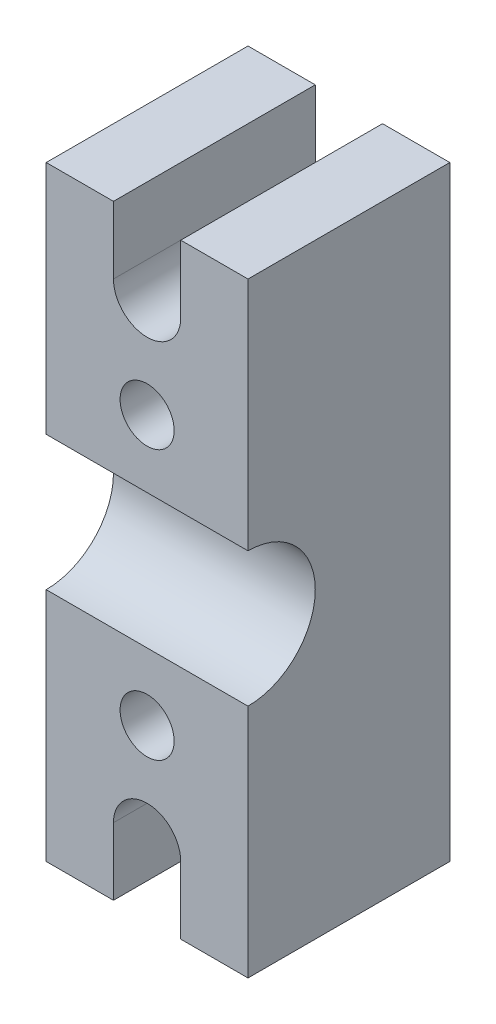
ISO-10303-21;
HEADER;
FILE_DESCRIPTION(('STEP AP214'),'2;1');
FILE_NAME('part.step','',(''),(''),'','','');
FILE_SCHEMA(('AUTOMOTIVE_DESIGN { 1 0 10303 214 1 1 1 1 }'));
ENDSEC;
DATA;
#1=APPLICATION_CONTEXT('core data for automotive mechanical design processes');
#2=APPLICATION_PROTOCOL_DEFINITION('international standard','automotive_design',2000,#1);
#3=PRODUCT_CONTEXT('',#1,'mechanical');
#4=PRODUCT('Part','Part','',(#3));
#5=PRODUCT_RELATED_PRODUCT_CATEGORY('part','',(#4));
#6=PRODUCT_DEFINITION_FORMATION('','',#4);
#7=PRODUCT_DEFINITION_CONTEXT('part definition',#1,'design');
#8=PRODUCT_DEFINITION('design','',#6,#7);
#9=PRODUCT_DEFINITION_SHAPE('','',#8);
#10=(LENGTH_UNIT() NAMED_UNIT(*) SI_UNIT(.MILLI.,.METRE.));
#11=(NAMED_UNIT(*) PLANE_ANGLE_UNIT() SI_UNIT($,.RADIAN.));
#12=(NAMED_UNIT(*) SI_UNIT($,.STERADIAN.) SOLID_ANGLE_UNIT());
#13=UNCERTAINTY_MEASURE_WITH_UNIT(LENGTH_MEASURE(1.E-05),#10,'distance_accuracy_value','');
#14=(GEOMETRIC_REPRESENTATION_CONTEXT(3) GLOBAL_UNCERTAINTY_ASSIGNED_CONTEXT((#13)) GLOBAL_UNIT_ASSIGNED_CONTEXT((#10,
#11,#12)) REPRESENTATION_CONTEXT('',''));
#15=CARTESIAN_POINT('',(0.,0.,0.));
#16=DIRECTION('',(0.,0.,1.));
#17=DIRECTION('',(1.,0.,0.));
#18=AXIS2_PLACEMENT_3D('',#15,#16,#17);
#19=CARTESIAN_POINT('',(0.,-22.225,19.05));
#20=DIRECTION('',(0.,0.,-1.));
#21=DIRECTION('',(-1.,0.,0.));
#22=AXIS2_PLACEMENT_3D('',#19,#20,#21);
#23=PLANE('',#22);
#24=CARTESIAN_POINT('',(0.,12.7,19.05));
#25=DIRECTION('',(0.,0.,1.));
#26=DIRECTION('',(1.,0.,0.));
#27=AXIS2_PLACEMENT_3D('',#24,#25,#26);
#28=CIRCLE('',#27,2.55269999999999);
#29=CARTESIAN_POINT('',(2.55269999999999,12.7,19.05));
#30=VERTEX_POINT('',#29);
#31=EDGE_CURVE('E276',#30,#30,#28,.T.);
#32=ORIENTED_EDGE('',*,*,#31,.F.);
#33=EDGE_LOOP('',(#32));
#34=FACE_BOUND('',#33,.T.);
#35=DIRECTION('',(0.,-1.,0.));
#36=VECTOR('',#35,1.);
#37=CARTESIAN_POINT('',(-9.525,-28.575,19.05));
#38=LINE('',#37,#36);
#39=CARTESIAN_POINT('',(-9.525,28.575,19.05));
#40=VERTEX_POINT('',#39);
#41=CARTESIAN_POINT('',(-9.525,6.35,19.05));
#42=VERTEX_POINT('',#41);
#43=EDGE_CURVE('E118',#40,#42,#38,.T.);
#44=ORIENTED_EDGE('',*,*,#43,.T.);
#45=DIRECTION('',(1.,0.,0.));
#46=VECTOR('',#45,1.);
#47=CARTESIAN_POINT('',(-9.525,6.35,19.05));
#48=LINE('',#47,#46);
#49=CARTESIAN_POINT('',(9.525,6.35,19.05));
#50=VERTEX_POINT('',#49);
#51=EDGE_CURVE('E11',#42,#50,#48,.T.);
#52=ORIENTED_EDGE('',*,*,#51,.T.);
#53=DIRECTION('',(0.,1.,0.));
#54=VECTOR('',#53,1.);
#55=CARTESIAN_POINT('',(9.525,-28.575,19.05));
#56=LINE('',#55,#54);
#57=CARTESIAN_POINT('',(9.525,28.575,19.05));
#58=VERTEX_POINT('',#57);
#59=EDGE_CURVE('E251',#50,#58,#56,.T.);
#60=ORIENTED_EDGE('',*,*,#59,.T.);
#61=DIRECTION('',(-1.,0.,0.));
#62=VECTOR('',#61,1.);
#63=CARTESIAN_POINT('',(9.525,28.575,19.05));
#64=LINE('',#63,#62);
#65=CARTESIAN_POINT('',(3.175,28.575,19.05));
#66=VERTEX_POINT('',#65);
#67=EDGE_CURVE('E152',#58,#66,#64,.T.);
#68=ORIENTED_EDGE('',*,*,#67,.T.);
#69=DIRECTION('',(0.,-1.,0.));
#70=VECTOR('',#69,1.);
#71=CARTESIAN_POINT('',(3.175,22.225,19.05));
#72=LINE('',#71,#70);
#73=CARTESIAN_POINT('',(3.175,22.225,19.05));
#74=VERTEX_POINT('',#73);
#75=EDGE_CURVE('E146',#66,#74,#72,.T.);
#76=ORIENTED_EDGE('',*,*,#75,.T.);
#77=CARTESIAN_POINT('',(0.,22.225,19.05));
#78=DIRECTION('',(0.,0.,-1.));
#79=DIRECTION('',(1.,0.,0.));
#80=AXIS2_PLACEMENT_3D('',#77,#78,#79);
#81=CIRCLE('',#80,3.175);
#82=CARTESIAN_POINT('',(-3.175,22.225,19.05));
#83=VERTEX_POINT('',#82);
#84=EDGE_CURVE('E149',#74,#83,#81,.T.);
#85=ORIENTED_EDGE('',*,*,#84,.T.);
#86=DIRECTION('',(0.,1.,0.));
#87=VECTOR('',#86,1.);
#88=CARTESIAN_POINT('',(-3.175,28.575,19.05));
#89=LINE('',#88,#87);
#90=CARTESIAN_POINT('',(-3.175,28.575,19.05));
#91=VERTEX_POINT('',#90);
#92=EDGE_CURVE('E65',#83,#91,#89,.T.);
#93=ORIENTED_EDGE('',*,*,#92,.T.);
#94=DIRECTION('',(-1.,0.,0.));
#95=VECTOR('',#94,1.);
#96=CARTESIAN_POINT('',(-3.175,28.575,19.05));
#97=LINE('',#96,#95);
#98=EDGE_CURVE('E197',#91,#40,#97,.T.);
#99=ORIENTED_EDGE('',*,*,#98,.T.);
#100=EDGE_LOOP('',(#44,#52,#60,#68,#76,#85,#93,#99));
#101=FACE_BOUND('',#100,.T.);
#102=ADVANCED_FACE('F41',(#34,#101),#23,.F.);
#103=CARTESIAN_POINT('',(-3.175,28.575,19.05));
#104=DIRECTION('',(0.,-1.,0.));
#105=DIRECTION('',(1.,0.,0.));
#106=AXIS2_PLACEMENT_3D('',#103,#104,#105);
#107=PLANE('',#106);
#108=DIRECTION('',(-1.,0.,0.));
#109=VECTOR('',#108,1.);
#110=CARTESIAN_POINT('',(-3.175,28.575,0.));
#111=LINE('',#110,#109);
#112=CARTESIAN_POINT('',(-3.175,28.575,0.));
#113=VERTEX_POINT('',#112);
#114=CARTESIAN_POINT('',(-9.525,28.575,0.));
#115=VERTEX_POINT('',#114);
#116=EDGE_CURVE('E173',#113,#115,#111,.T.);
#117=ORIENTED_EDGE('',*,*,#116,.T.);
#118=DIRECTION('',(0.,0.,-1.));
#119=VECTOR('',#118,1.);
#120=CARTESIAN_POINT('',(-9.525,28.575,19.05));
#121=LINE('',#120,#119);
#122=EDGE_CURVE('E222',#40,#115,#121,.T.);
#123=ORIENTED_EDGE('',*,*,#122,.F.);
#124=ORIENTED_EDGE('',*,*,#98,.F.);
#125=DIRECTION('',(0.,0.,-1.));
#126=VECTOR('',#125,1.);
#127=CARTESIAN_POINT('',(-3.175,28.575,19.05));
#128=LINE('',#127,#126);
#129=EDGE_CURVE('E169',#91,#113,#128,.T.);
#130=ORIENTED_EDGE('',*,*,#129,.T.);
#131=EDGE_LOOP('',(#117,#123,#124,#130));
#132=FACE_BOUND('',#131,.T.);
#133=ADVANCED_FACE('F43',(#132),#107,.F.);
#134=CARTESIAN_POINT('',(-9.525,-28.575,19.05));
#135=DIRECTION('',(1.,0.,0.));
#136=DIRECTION('',(0.,0.,-1.));
#137=AXIS2_PLACEMENT_3D('',#134,#135,#136);
#138=PLANE('',#137);
#139=CARTESIAN_POINT('',(-9.525,-6.35,19.05));
#140=VERTEX_POINT('',#139);
#141=CARTESIAN_POINT('',(-9.525,-28.575,19.05));
#142=VERTEX_POINT('',#141);
#143=EDGE_CURVE('E227',#140,#142,#38,.T.);
#144=ORIENTED_EDGE('',*,*,#143,.F.);
#145=CARTESIAN_POINT('',(-9.525,0.,19.05));
#146=DIRECTION('',(1.,0.,0.));
#147=DIRECTION('',(0.,0.,-1.));
#148=AXIS2_PLACEMENT_3D('',#145,#146,#147);
#149=CIRCLE('',#148,6.35);
#150=EDGE_CURVE('E56',#140,#42,#149,.T.);
#151=ORIENTED_EDGE('',*,*,#150,.T.);
#152=ORIENTED_EDGE('',*,*,#43,.F.);
#153=ORIENTED_EDGE('',*,*,#122,.T.);
#154=DIRECTION('',(0.,-1.,0.));
#155=VECTOR('',#154,1.);
#156=CARTESIAN_POINT('',(-9.525,-28.575,0.));
#157=LINE('',#156,#155);
#158=CARTESIAN_POINT('',(-9.525,-28.575,0.));
#159=VERTEX_POINT('',#158);
#160=EDGE_CURVE('E176',#115,#159,#157,.T.);
#161=ORIENTED_EDGE('',*,*,#160,.T.);
#162=DIRECTION('',(0.,0.,-1.));
#163=VECTOR('',#162,1.);
#164=CARTESIAN_POINT('',(-9.525,-28.575,19.05));
#165=LINE('',#164,#163);
#166=EDGE_CURVE('E219',#142,#159,#165,.T.);
#167=ORIENTED_EDGE('',*,*,#166,.F.);
#168=EDGE_LOOP('',(#144,#151,#152,#153,#161,#167));
#169=FACE_BOUND('',#168,.T.);
#170=ADVANCED_FACE('F234',(#169),#138,.F.);
#171=CARTESIAN_POINT('',(-3.175,-28.575,19.05));
#172=DIRECTION('',(0.,1.,0.));
#173=DIRECTION('',(0.,0.,1.));
#174=AXIS2_PLACEMENT_3D('',#171,#172,#173);
#175=PLANE('',#174);
#176=DIRECTION('',(1.,0.,0.));
#177=VECTOR('',#176,1.);
#178=CARTESIAN_POINT('',(-3.175,-28.575,0.));
#179=LINE('',#178,#177);
#180=CARTESIAN_POINT('',(-3.175,-28.575,0.));
#181=VERTEX_POINT('',#180);
#182=EDGE_CURVE('E179',#159,#181,#179,.T.);
#183=ORIENTED_EDGE('',*,*,#182,.T.);
#184=DIRECTION('',(0.,0.,-1.));
#185=VECTOR('',#184,1.);
#186=CARTESIAN_POINT('',(-3.175,-28.575,19.05));
#187=LINE('',#186,#185);
#188=CARTESIAN_POINT('',(-3.175,-28.575,19.05));
#189=VERTEX_POINT('',#188);
#190=EDGE_CURVE('E216',#189,#181,#187,.T.);
#191=ORIENTED_EDGE('',*,*,#190,.F.);
#192=DIRECTION('',(1.,0.,0.));
#193=VECTOR('',#192,1.);
#194=CARTESIAN_POINT('',(-3.175,-28.575,19.05));
#195=LINE('',#194,#193);
#196=EDGE_CURVE('E238',#142,#189,#195,.T.);
#197=ORIENTED_EDGE('',*,*,#196,.F.);
#198=ORIENTED_EDGE('',*,*,#166,.T.);
#199=EDGE_LOOP('',(#183,#191,#197,#198));
#200=FACE_BOUND('',#199,.T.);
#201=ADVANCED_FACE('F368',(#200),#175,.F.);
#202=CARTESIAN_POINT('',(-3.175,-28.575,19.05));
#203=DIRECTION('',(-1.,0.,0.));
#204=DIRECTION('',(0.,0.,1.));
#205=AXIS2_PLACEMENT_3D('',#202,#203,#204);
#206=PLANE('',#205);
#207=DIRECTION('',(0.,1.,0.));
#208=VECTOR('',#207,1.);
#209=CARTESIAN_POINT('',(-3.175,-28.575,0.));
#210=LINE('',#209,#208);
#211=CARTESIAN_POINT('',(-3.175,-22.225,0.));
#212=VERTEX_POINT('',#211);
#213=EDGE_CURVE('E181',#181,#212,#210,.T.);
#214=ORIENTED_EDGE('',*,*,#213,.T.);
#215=DIRECTION('',(0.,0.,-1.));
#216=VECTOR('',#215,1.);
#217=CARTESIAN_POINT('',(-3.175,-22.225,19.05));
#218=LINE('',#217,#216);
#219=CARTESIAN_POINT('',(-3.175,-22.225,19.05));
#220=VERTEX_POINT('',#219);
#221=EDGE_CURVE('E213',#220,#212,#218,.T.);
#222=ORIENTED_EDGE('',*,*,#221,.F.);
#223=DIRECTION('',(0.,1.,0.));
#224=VECTOR('',#223,1.);
#225=CARTESIAN_POINT('',(-3.175,-28.575,19.05));
#226=LINE('',#225,#224);
#227=EDGE_CURVE('E243',#189,#220,#226,.T.);
#228=ORIENTED_EDGE('',*,*,#227,.F.);
#229=ORIENTED_EDGE('',*,*,#190,.T.);
#230=EDGE_LOOP('',(#214,#222,#228,#229));
#231=FACE_BOUND('',#230,.T.);
#232=ADVANCED_FACE('F478',(#231),#206,.F.);
#233=CARTESIAN_POINT('',(0.,-22.225,19.05));
#234=DIRECTION('',(0.,0.,-1.));
#235=DIRECTION('',(-1.,0.,0.));
#236=AXIS2_PLACEMENT_3D('',#233,#234,#235);
#237=CYLINDRICAL_SURFACE('',#236,3.175);
#238=CARTESIAN_POINT('',(0.,-22.225,0.));
#239=DIRECTION('',(0.,0.,-1.));
#240=DIRECTION('',(-1.,0.,0.));
#241=AXIS2_PLACEMENT_3D('',#238,#239,#240);
#242=CIRCLE('',#241,3.175);
#243=CARTESIAN_POINT('',(3.175,-22.225,0.));
#244=VERTEX_POINT('',#243);
#245=EDGE_CURVE('E183',#212,#244,#242,.T.);
#246=ORIENTED_EDGE('',*,*,#245,.T.);
#247=DIRECTION('',(0.,0.,-1.));
#248=VECTOR('',#247,1.);
#249=CARTESIAN_POINT('',(3.175,-22.225,19.05));
#250=LINE('',#249,#248);
#251=CARTESIAN_POINT('',(3.175,-22.225,19.05));
#252=VERTEX_POINT('',#251);
#253=EDGE_CURVE('E210',#252,#244,#250,.T.);
#254=ORIENTED_EDGE('',*,*,#253,.F.);
#255=CARTESIAN_POINT('',(0.,-22.225,19.05));
#256=DIRECTION('',(0.,0.,-1.));
#257=DIRECTION('',(-1.,0.,0.));
#258=AXIS2_PLACEMENT_3D('',#255,#256,#257);
#259=CIRCLE('',#258,3.175);
#260=EDGE_CURVE('E245',#220,#252,#259,.T.);
#261=ORIENTED_EDGE('',*,*,#260,.F.);
#262=ORIENTED_EDGE('',*,*,#221,.T.);
#263=EDGE_LOOP('',(#246,#254,#261,#262));
#264=FACE_BOUND('',#263,.T.);
#265=ADVANCED_FACE('F468',(#264),#237,.F.);
#266=CARTESIAN_POINT('',(3.175,-22.225,19.05));
#267=DIRECTION('',(1.,0.,0.));
#268=DIRECTION('',(0.,1.,0.));
#269=AXIS2_PLACEMENT_3D('',#266,#267,#268);
#270=PLANE('',#269);
#271=DIRECTION('',(0.,-1.,0.));
#272=VECTOR('',#271,1.);
#273=CARTESIAN_POINT('',(3.175,-22.225,0.));
#274=LINE('',#273,#272);
#275=CARTESIAN_POINT('',(3.175,-28.575,0.));
#276=VERTEX_POINT('',#275);
#277=EDGE_CURVE('E185',#244,#276,#274,.T.);
#278=ORIENTED_EDGE('',*,*,#277,.T.);
#279=DIRECTION('',(0.,0.,-1.));
#280=VECTOR('',#279,1.);
#281=CARTESIAN_POINT('',(3.175,-28.575,19.05));
#282=LINE('',#281,#280);
#283=CARTESIAN_POINT('',(3.175,-28.575,19.05));
#284=VERTEX_POINT('',#283);
#285=EDGE_CURVE('E207',#284,#276,#282,.T.);
#286=ORIENTED_EDGE('',*,*,#285,.F.);
#287=DIRECTION('',(0.,-1.,0.));
#288=VECTOR('',#287,1.);
#289=CARTESIAN_POINT('',(3.175,-22.225,19.05));
#290=LINE('',#289,#288);
#291=EDGE_CURVE('E247',#252,#284,#290,.T.);
#292=ORIENTED_EDGE('',*,*,#291,.F.);
#293=ORIENTED_EDGE('',*,*,#253,.T.);
#294=EDGE_LOOP('',(#278,#286,#292,#293));
#295=FACE_BOUND('',#294,.T.);
#296=ADVANCED_FACE('F458',(#295),#270,.F.);
#297=CARTESIAN_POINT('',(9.525,-28.575,19.05));
#298=DIRECTION('',(0.,1.,0.));
#299=DIRECTION('',(0.,0.,1.));
#300=AXIS2_PLACEMENT_3D('',#297,#298,#299);
#301=PLANE('',#300);
#302=DIRECTION('',(1.,0.,0.));
#303=VECTOR('',#302,1.);
#304=CARTESIAN_POINT('',(9.525,-28.575,0.));
#305=LINE('',#304,#303);
#306=CARTESIAN_POINT('',(9.525,-28.575,0.));
#307=VERTEX_POINT('',#306);
#308=EDGE_CURVE('E187',#276,#307,#305,.T.);
#309=ORIENTED_EDGE('',*,*,#308,.T.);
#310=DIRECTION('',(0.,0.,-1.));
#311=VECTOR('',#310,1.);
#312=CARTESIAN_POINT('',(9.525,-28.575,19.05));
#313=LINE('',#312,#311);
#314=CARTESIAN_POINT('',(9.525,-28.575,19.05));
#315=VERTEX_POINT('',#314);
#316=EDGE_CURVE('E204',#315,#307,#313,.T.);
#317=ORIENTED_EDGE('',*,*,#316,.F.);
#318=DIRECTION('',(1.,0.,0.));
#319=VECTOR('',#318,1.);
#320=CARTESIAN_POINT('',(9.525,-28.575,19.05));
#321=LINE('',#320,#319);
#322=EDGE_CURVE('E249',#284,#315,#321,.T.);
#323=ORIENTED_EDGE('',*,*,#322,.F.);
#324=ORIENTED_EDGE('',*,*,#285,.T.);
#325=EDGE_LOOP('',(#309,#317,#323,#324));
#326=FACE_BOUND('',#325,.T.);
#327=ADVANCED_FACE('F379',(#326),#301,.F.);
#328=CARTESIAN_POINT('',(9.525,-28.575,19.05));
#329=DIRECTION('',(-1.,0.,0.));
#330=DIRECTION('',(0.,0.,1.));
#331=AXIS2_PLACEMENT_3D('',#328,#329,#330);
#332=PLANE('',#331);
#333=ORIENTED_EDGE('',*,*,#59,.F.);
#334=CARTESIAN_POINT('',(9.525,0.,19.05));
#335=DIRECTION('',(1.,0.,0.));
#336=DIRECTION('',(0.,0.,-1.));
#337=AXIS2_PLACEMENT_3D('',#334,#335,#336);
#338=CIRCLE('',#337,6.35);
#339=CARTESIAN_POINT('',(9.525,-6.35,19.05));
#340=VERTEX_POINT('',#339);
#341=EDGE_CURVE('E273',#340,#50,#338,.T.);
#342=ORIENTED_EDGE('',*,*,#341,.F.);
#343=EDGE_CURVE('E231',#315,#340,#56,.T.);
#344=ORIENTED_EDGE('',*,*,#343,.F.);
#345=ORIENTED_EDGE('',*,*,#316,.T.);
#346=DIRECTION('',(0.,1.,0.));
#347=VECTOR('',#346,1.);
#348=CARTESIAN_POINT('',(9.525,-28.575,0.));
#349=LINE('',#348,#347);
#350=CARTESIAN_POINT('',(9.525,28.575,0.));
#351=VERTEX_POINT('',#350);
#352=EDGE_CURVE('E189',#307,#351,#349,.T.);
#353=ORIENTED_EDGE('',*,*,#352,.T.);
#354=DIRECTION('',(0.,0.,-1.));
#355=VECTOR('',#354,1.);
#356=CARTESIAN_POINT('',(9.525,28.575,19.05));
#357=LINE('',#356,#355);
#358=EDGE_CURVE('E201',#58,#351,#357,.T.);
#359=ORIENTED_EDGE('',*,*,#358,.F.);
#360=EDGE_LOOP('',(#333,#342,#344,#345,#353,#359));
#361=FACE_BOUND('',#360,.T.);
#362=ADVANCED_FACE('F256',(#361),#332,.F.);
#363=CARTESIAN_POINT('',(9.525,28.575,19.05));
#364=DIRECTION('',(0.,-1.,0.));
#365=DIRECTION('',(1.,0.,0.));
#366=AXIS2_PLACEMENT_3D('',#363,#364,#365);
#367=PLANE('',#366);
#368=DIRECTION('',(-1.,0.,0.));
#369=VECTOR('',#368,1.);
#370=CARTESIAN_POINT('',(9.525,28.575,0.));
#371=LINE('',#370,#369);
#372=CARTESIAN_POINT('',(3.175,28.575,0.));
#373=VERTEX_POINT('',#372);
#374=EDGE_CURVE('E191',#351,#373,#371,.T.);
#375=ORIENTED_EDGE('',*,*,#374,.T.);
#376=DIRECTION('',(0.,0.,-1.));
#377=VECTOR('',#376,1.);
#378=CARTESIAN_POINT('',(3.175,28.575,19.05));
#379=LINE('',#378,#377);
#380=EDGE_CURVE('E164',#66,#373,#379,.T.);
#381=ORIENTED_EDGE('',*,*,#380,.F.);
#382=ORIENTED_EDGE('',*,*,#67,.F.);
#383=ORIENTED_EDGE('',*,*,#358,.T.);
#384=EDGE_LOOP('',(#375,#381,#382,#383));
#385=FACE_BOUND('',#384,.T.);
#386=ADVANCED_FACE('F260',(#385),#367,.F.);
#387=CARTESIAN_POINT('',(3.175,22.225,19.05));
#388=DIRECTION('',(1.,0.,0.));
#389=DIRECTION('',(0.,1.,0.));
#390=AXIS2_PLACEMENT_3D('',#387,#388,#389);
#391=PLANE('',#390);
#392=DIRECTION('',(0.,-1.,0.));
#393=VECTOR('',#392,1.);
#394=CARTESIAN_POINT('',(3.175,22.225,0.));
#395=LINE('',#394,#393);
#396=CARTESIAN_POINT('',(3.175,22.225,0.));
#397=VERTEX_POINT('',#396);
#398=EDGE_CURVE('E161',#373,#397,#395,.T.);
#399=ORIENTED_EDGE('',*,*,#398,.T.);
#400=DIRECTION('',(0.,0.,-1.));
#401=VECTOR('',#400,1.);
#402=CARTESIAN_POINT('',(3.175,22.225,19.05));
#403=LINE('',#402,#401);
#404=EDGE_CURVE('E158',#74,#397,#403,.T.);
#405=ORIENTED_EDGE('',*,*,#404,.F.);
#406=ORIENTED_EDGE('',*,*,#75,.F.);
#407=ORIENTED_EDGE('',*,*,#380,.T.);
#408=EDGE_LOOP('',(#399,#405,#406,#407));
#409=FACE_BOUND('',#408,.T.);
#410=ADVANCED_FACE('F159',(#409),#391,.F.);
#411=CARTESIAN_POINT('',(0.,22.225,19.05));
#412=DIRECTION('',(0.,0.,-1.));
#413=DIRECTION('',(-1.,0.,0.));
#414=AXIS2_PLACEMENT_3D('',#411,#412,#413);
#415=CYLINDRICAL_SURFACE('',#414,3.175);
#416=CARTESIAN_POINT('',(0.,22.225,0.));
#417=DIRECTION('',(0.,0.,-1.));
#418=DIRECTION('',(1.,0.,0.));
#419=AXIS2_PLACEMENT_3D('',#416,#417,#418);
#420=CIRCLE('',#419,3.175);
#421=CARTESIAN_POINT('',(-3.175,22.225,0.));
#422=VERTEX_POINT('',#421);
#423=EDGE_CURVE('E194',#397,#422,#420,.T.);
#424=ORIENTED_EDGE('',*,*,#423,.T.);
#425=DIRECTION('',(0.,0.,-1.));
#426=VECTOR('',#425,1.);
#427=CARTESIAN_POINT('',(-3.175,22.225,19.05));
#428=LINE('',#427,#426);
#429=EDGE_CURVE('E165',#83,#422,#428,.T.);
#430=ORIENTED_EDGE('',*,*,#429,.F.);
#431=ORIENTED_EDGE('',*,*,#84,.F.);
#432=ORIENTED_EDGE('',*,*,#404,.T.);
#433=EDGE_LOOP('',(#424,#430,#431,#432));
#434=FACE_BOUND('',#433,.T.);
#435=ADVANCED_FACE('F167',(#434),#415,.F.);
#436=CARTESIAN_POINT('',(-3.175,28.575,19.05));
#437=DIRECTION('',(-1.,0.,0.));
#438=DIRECTION('',(0.,0.,1.));
#439=AXIS2_PLACEMENT_3D('',#436,#437,#438);
#440=PLANE('',#439);
#441=DIRECTION('',(0.,1.,0.));
#442=VECTOR('',#441,1.);
#443=CARTESIAN_POINT('',(-3.175,28.575,0.));
#444=LINE('',#443,#442);
#445=EDGE_CURVE('E110',#422,#113,#444,.T.);
#446=ORIENTED_EDGE('',*,*,#445,.T.);
#447=ORIENTED_EDGE('',*,*,#129,.F.);
#448=ORIENTED_EDGE('',*,*,#92,.F.);
#449=ORIENTED_EDGE('',*,*,#429,.T.);
#450=EDGE_LOOP('',(#446,#447,#448,#449));
#451=FACE_BOUND('',#450,.T.);
#452=ADVANCED_FACE('F264',(#451),#440,.F.);
#453=CARTESIAN_POINT('',(0.,-12.7,19.05));
#454=DIRECTION('',(0.,0.,1.));
#455=DIRECTION('',(1.,0.,0.));
#456=AXIS2_PLACEMENT_3D('',#453,#454,#455);
#457=CIRCLE('',#456,2.55269999999999);
#458=CARTESIAN_POINT('',(2.55269999999999,-12.7,19.05));
#459=VERTEX_POINT('',#458);
#460=EDGE_CURVE('E284',#459,#459,#457,.T.);
#461=ORIENTED_EDGE('',*,*,#460,.F.);
#462=EDGE_LOOP('',(#461));
#463=FACE_BOUND('',#462,.T.);
#464=ORIENTED_EDGE('',*,*,#343,.T.);
#465=DIRECTION('',(1.,0.,0.));
#466=VECTOR('',#465,1.);
#467=CARTESIAN_POINT('',(-9.525,-6.35,19.05));
#468=LINE('',#467,#466);
#469=EDGE_CURVE('E49',#340,#140,#468,.F.);
#470=ORIENTED_EDGE('',*,*,#469,.T.);
#471=ORIENTED_EDGE('',*,*,#143,.T.);
#472=ORIENTED_EDGE('',*,*,#196,.T.);
#473=ORIENTED_EDGE('',*,*,#227,.T.);
#474=ORIENTED_EDGE('',*,*,#260,.T.);
#475=ORIENTED_EDGE('',*,*,#291,.T.);
#476=ORIENTED_EDGE('',*,*,#322,.T.);
#477=EDGE_LOOP('',(#464,#470,#471,#472,#473,#474,#475,#476));
#478=FACE_BOUND('',#477,.T.);
#479=ADVANCED_FACE('F226',(#463,#478),#23,.F.);
#480=CARTESIAN_POINT('',(0.,-22.225,0.));
#481=DIRECTION('',(0.,0.,-1.));
#482=DIRECTION('',(-1.,0.,0.));
#483=AXIS2_PLACEMENT_3D('',#480,#481,#482);
#484=PLANE('',#483);
#485=ORIENTED_EDGE('',*,*,#116,.F.);
#486=ORIENTED_EDGE('',*,*,#445,.F.);
#487=ORIENTED_EDGE('',*,*,#423,.F.);
#488=ORIENTED_EDGE('',*,*,#398,.F.);
#489=ORIENTED_EDGE('',*,*,#374,.F.);
#490=ORIENTED_EDGE('',*,*,#352,.F.);
#491=ORIENTED_EDGE('',*,*,#308,.F.);
#492=ORIENTED_EDGE('',*,*,#277,.F.);
#493=ORIENTED_EDGE('',*,*,#245,.F.);
#494=ORIENTED_EDGE('',*,*,#213,.F.);
#495=ORIENTED_EDGE('',*,*,#182,.F.);
#496=ORIENTED_EDGE('',*,*,#160,.F.);
#497=EDGE_LOOP('',(#485,#486,#487,#488,#489,#490,#491,#492,#493,#494,#495,#496));
#498=FACE_BOUND('',#497,.T.);
#499=ADVANCED_FACE('F263',(#498),#484,.T.);
#500=CARTESIAN_POINT('',(0.,-12.7,2.54));
#501=DIRECTION('',(0.,0.,1.));
#502=DIRECTION('',(1.,0.,0.));
#503=AXIS2_PLACEMENT_3D('',#500,#501,#502);
#504=CONICAL_SURFACE('',#503,2.55269999999999,1.02974425867665);
#505=CARTESIAN_POINT('',(0.,-12.7,1.00618309780836));
#506=VERTEX_POINT('',#505);
#507=VERTEX_LOOP('',#506);
#508=FACE_BOUND('',#507,.T.);
#509=CARTESIAN_POINT('',(0.,-12.7,2.54));
#510=DIRECTION('',(0.,0.,1.));
#511=DIRECTION('',(1.,0.,0.));
#512=AXIS2_PLACEMENT_3D('',#509,#510,#511);
#513=CIRCLE('',#512,2.55269999999999);
#514=CARTESIAN_POINT('',(2.55269999999999,-12.7,2.54));
#515=VERTEX_POINT('',#514);
#516=EDGE_CURVE('E177',#515,#515,#513,.T.);
#517=ORIENTED_EDGE('',*,*,#516,.T.);
#518=EDGE_LOOP('',(#517));
#519=FACE_BOUND('',#518,.T.);
#520=ADVANCED_FACE('F289',(#508,#519),#504,.F.);
#521=CARTESIAN_POINT('',(0.,-12.7,19.05));
#522=DIRECTION('',(0.,0.,1.));
#523=DIRECTION('',(1.,0.,0.));
#524=AXIS2_PLACEMENT_3D('',#521,#522,#523);
#525=CYLINDRICAL_SURFACE('',#524,2.55269999999999);
#526=ORIENTED_EDGE('',*,*,#516,.F.);
#527=EDGE_LOOP('',(#526));
#528=FACE_BOUND('',#527,.T.);
#529=ORIENTED_EDGE('',*,*,#460,.T.);
#530=EDGE_LOOP('',(#529));
#531=FACE_BOUND('',#530,.T.);
#532=ADVANCED_FACE('F291',(#528,#531),#525,.F.);
#533=CARTESIAN_POINT('',(0.,12.7,2.54));
#534=DIRECTION('',(0.,0.,1.));
#535=DIRECTION('',(1.,0.,0.));
#536=AXIS2_PLACEMENT_3D('',#533,#534,#535);
#537=CONICAL_SURFACE('',#536,2.55269999999999,1.02974425867665);
#538=CARTESIAN_POINT('',(0.,12.7,1.00618309780836));
#539=VERTEX_POINT('',#538);
#540=VERTEX_LOOP('',#539);
#541=FACE_BOUND('',#540,.T.);
#542=CARTESIAN_POINT('',(0.,12.7,2.54));
#543=DIRECTION('',(0.,0.,1.));
#544=DIRECTION('',(1.,0.,0.));
#545=AXIS2_PLACEMENT_3D('',#542,#543,#544);
#546=CIRCLE('',#545,2.55269999999999);
#547=CARTESIAN_POINT('',(2.55269999999999,12.7,2.54));
#548=VERTEX_POINT('',#547);
#549=EDGE_CURVE('E281',#548,#548,#546,.T.);
#550=ORIENTED_EDGE('',*,*,#549,.T.);
#551=EDGE_LOOP('',(#550));
#552=FACE_BOUND('',#551,.T.);
#553=ADVANCED_FACE('F294',(#541,#552),#537,.F.);
#554=CARTESIAN_POINT('',(0.,12.7,19.05));
#555=DIRECTION('',(0.,0.,1.));
#556=DIRECTION('',(1.,0.,0.));
#557=AXIS2_PLACEMENT_3D('',#554,#555,#556);
#558=CYLINDRICAL_SURFACE('',#557,2.55269999999999);
#559=ORIENTED_EDGE('',*,*,#549,.F.);
#560=EDGE_LOOP('',(#559));
#561=FACE_BOUND('',#560,.T.);
#562=ORIENTED_EDGE('',*,*,#31,.T.);
#563=EDGE_LOOP('',(#562));
#564=FACE_BOUND('',#563,.T.);
#565=ADVANCED_FACE('F314',(#561,#564),#558,.F.);
#566=CARTESIAN_POINT('',(-9.525,0.,19.05));
#567=DIRECTION('',(1.,0.,0.));
#568=DIRECTION('',(0.,0.,-1.));
#569=AXIS2_PLACEMENT_3D('',#566,#567,#568);
#570=CYLINDRICAL_SURFACE('',#569,6.35);
#571=ORIENTED_EDGE('',*,*,#150,.F.);
#572=ORIENTED_EDGE('',*,*,#469,.F.);
#573=ORIENTED_EDGE('',*,*,#341,.T.);
#574=ORIENTED_EDGE('',*,*,#51,.F.);
#575=EDGE_LOOP('',(#571,#572,#573,#574));
#576=FACE_BOUND('',#575,.T.);
#577=ADVANCED_FACE('F274',(#576),#570,.F.);
#578=CLOSED_SHELL('',(#102,#133,#170,#201,#232,#265,#296,#327,#362,#386,#410,#435,#452,#479,
#499,#520,#532,#553,#565,#577));
#579=MANIFOLD_SOLID_BREP('B2',#578);
#580=ADVANCED_BREP_SHAPE_REPRESENTATION('',(#18,#579),#14);
#581=SHAPE_DEFINITION_REPRESENTATION(#9,#580);
ENDSEC;
END-ISO-10303-21;
